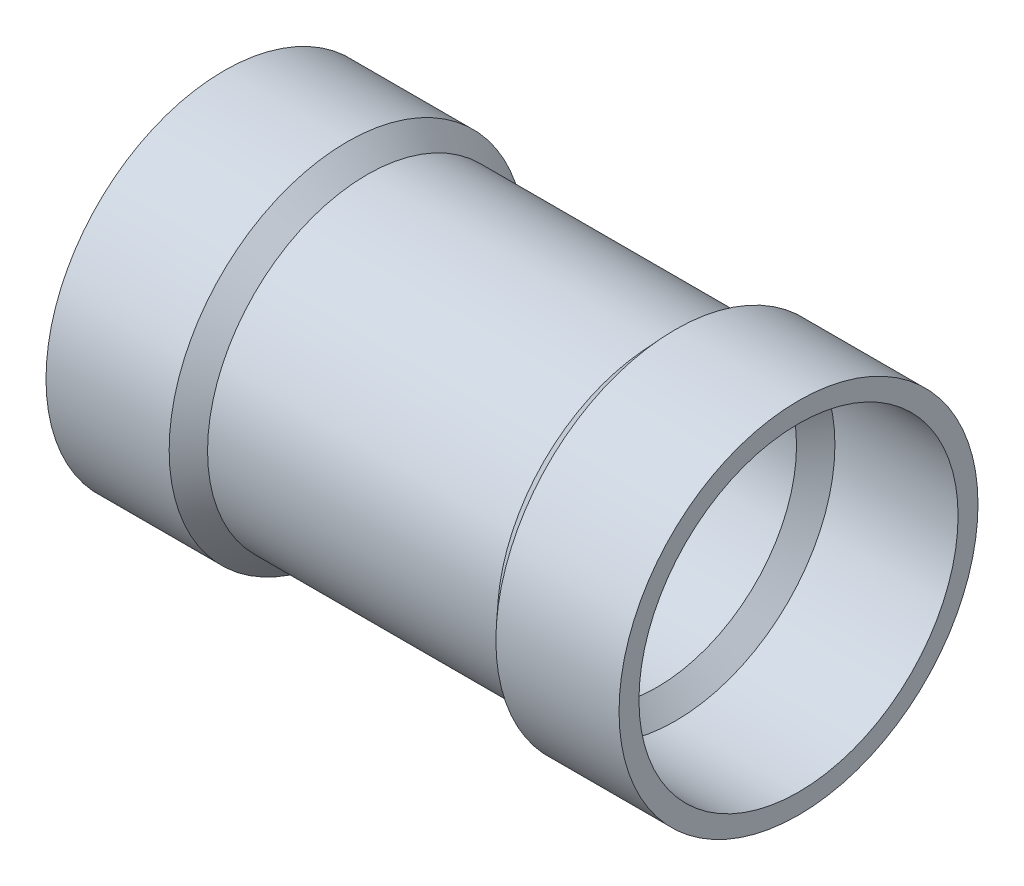
ISO-10303-21;
HEADER;
FILE_DESCRIPTION(('STEP AP214'),'2;1');
FILE_NAME('part.step','',(''),(''),'','','');
FILE_SCHEMA(('AUTOMOTIVE_DESIGN { 1 0 10303 214 1 1 1 1 }'));
ENDSEC;
DATA;
#1=APPLICATION_CONTEXT('core data for automotive mechanical design processes');
#2=APPLICATION_PROTOCOL_DEFINITION('international standard','automotive_design',2000,#1);
#3=PRODUCT_CONTEXT('',#1,'mechanical');
#4=PRODUCT('Part','Part','',(#3));
#5=PRODUCT_RELATED_PRODUCT_CATEGORY('part','',(#4));
#6=PRODUCT_DEFINITION_FORMATION('','',#4);
#7=PRODUCT_DEFINITION_CONTEXT('part definition',#1,'design');
#8=PRODUCT_DEFINITION('design','',#6,#7);
#9=PRODUCT_DEFINITION_SHAPE('','',#8);
#10=(LENGTH_UNIT() NAMED_UNIT(*) SI_UNIT(.MILLI.,.METRE.));
#11=(NAMED_UNIT(*) PLANE_ANGLE_UNIT() SI_UNIT($,.RADIAN.));
#12=(NAMED_UNIT(*) SI_UNIT($,.STERADIAN.) SOLID_ANGLE_UNIT());
#13=UNCERTAINTY_MEASURE_WITH_UNIT(LENGTH_MEASURE(1.E-05),#10,'distance_accuracy_value','');
#14=(GEOMETRIC_REPRESENTATION_CONTEXT(3) GLOBAL_UNCERTAINTY_ASSIGNED_CONTEXT((#13)) GLOBAL_UNIT_ASSIGNED_CONTEXT((#10,
#11,#12)) REPRESENTATION_CONTEXT('',''));
#15=CARTESIAN_POINT('',(0.,0.,0.));
#16=DIRECTION('',(0.,0.,1.));
#17=DIRECTION('',(1.,0.,0.));
#18=AXIS2_PLACEMENT_3D('',#15,#16,#17);
#19=CARTESIAN_POINT('',(-79.5,0.,0.));
#20=DIRECTION('',(-1.,0.,0.));
#21=DIRECTION('',(0.,0.,1.));
#22=AXIS2_PLACEMENT_3D('',#19,#20,#21);
#23=CYLINDRICAL_SURFACE('',#22,44.0509804864072);
#24=CARTESIAN_POINT('',(-40.,0.,0.));
#25=DIRECTION('',(-1.,0.,0.));
#26=DIRECTION('',(0.,0.,1.));
#27=AXIS2_PLACEMENT_3D('',#24,#25,#26);
#28=CIRCLE('',#27,44.0509804864072);
#29=CARTESIAN_POINT('',(-40.,0.,44.0509804864072));
#30=VERTEX_POINT('',#29);
#31=EDGE_CURVE('E78',#30,#30,#28,.T.);
#32=ORIENTED_EDGE('',*,*,#31,.F.);
#33=EDGE_LOOP('',(#32));
#34=FACE_BOUND('',#33,.T.);
#35=CARTESIAN_POINT('',(40.,0.,0.));
#36=DIRECTION('',(-1.,0.,0.));
#37=DIRECTION('',(0.,0.,1.));
#38=AXIS2_PLACEMENT_3D('',#35,#36,#37);
#39=CIRCLE('',#38,44.0509804864072);
#40=CARTESIAN_POINT('',(40.,0.,44.0509804864072));
#41=VERTEX_POINT('',#40);
#42=EDGE_CURVE('E10',#41,#41,#39,.T.);
#43=ORIENTED_EDGE('',*,*,#42,.T.);
#44=EDGE_LOOP('',(#43));
#45=FACE_BOUND('',#44,.T.);
#46=ADVANCED_FACE('F38',(#34,#45),#23,.T.);
#47=CARTESIAN_POINT('',(45.0990195135928,0.,0.));
#48=DIRECTION('',(1.,0.,0.));
#49=DIRECTION('',(0.,0.,-1.));
#50=AXIS2_PLACEMENT_3D('',#47,#48,#49);
#51=CONICAL_SURFACE('',#50,49.5509804864072,0.823211977125876);
#52=ORIENTED_EDGE('',*,*,#42,.F.);
#53=EDGE_LOOP('',(#52));
#54=FACE_BOUND('',#53,.T.);
#55=CARTESIAN_POINT('',(45.0990195135928,0.,0.));
#56=DIRECTION('',(-1.,0.,0.));
#57=DIRECTION('',(0.,0.,1.));
#58=AXIS2_PLACEMENT_3D('',#55,#56,#57);
#59=CIRCLE('',#58,49.5509804864072);
#60=CARTESIAN_POINT('',(45.0990195135928,0.,49.5509804864072));
#61=VERTEX_POINT('',#60);
#62=EDGE_CURVE('E44',#61,#61,#59,.T.);
#63=ORIENTED_EDGE('',*,*,#62,.T.);
#64=EDGE_LOOP('',(#63));
#65=FACE_BOUND('',#64,.T.);
#66=ADVANCED_FACE('F85',(#54,#65),#51,.T.);
#67=CARTESIAN_POINT('',(-79.5,0.,0.));
#68=DIRECTION('',(-1.,0.,0.));
#69=DIRECTION('',(0.,0.,1.));
#70=AXIS2_PLACEMENT_3D('',#67,#68,#69);
#71=CYLINDRICAL_SURFACE('',#70,49.5509804864072);
#72=ORIENTED_EDGE('',*,*,#62,.F.);
#73=EDGE_LOOP('',(#72));
#74=FACE_BOUND('',#73,.T.);
#75=CARTESIAN_POINT('',(79.0990195135928,0.,0.));
#76=DIRECTION('',(-1.,0.,0.));
#77=DIRECTION('',(0.,0.,1.));
#78=AXIS2_PLACEMENT_3D('',#75,#76,#77);
#79=CIRCLE('',#78,49.5509804864072);
#80=CARTESIAN_POINT('',(79.0990195135928,0.,49.5509804864072));
#81=VERTEX_POINT('',#80);
#82=EDGE_CURVE('E48',#81,#81,#79,.T.);
#83=ORIENTED_EDGE('',*,*,#82,.T.);
#84=EDGE_LOOP('',(#83));
#85=FACE_BOUND('',#84,.T.);
#86=ADVANCED_FACE('F89',(#74,#85),#71,.T.);
#87=CARTESIAN_POINT('',(79.0990195135928,49.5509804864072,0.));
#88=DIRECTION('',(-1.,0.,0.));
#89=DIRECTION('',(0.,0.,1.));
#90=AXIS2_PLACEMENT_3D('',#87,#88,#89);
#91=PLANE('',#90);
#92=ORIENTED_EDGE('',*,*,#82,.F.);
#93=EDGE_LOOP('',(#92));
#94=FACE_BOUND('',#93,.T.);
#95=CARTESIAN_POINT('',(79.0990195135928,0.,0.));
#96=DIRECTION('',(-1.,0.,0.));
#97=DIRECTION('',(0.,0.,1.));
#98=AXIS2_PLACEMENT_3D('',#95,#96,#97);
#99=CIRCLE('',#98,44.0509804864072);
#100=CARTESIAN_POINT('',(79.0990195135928,0.,44.0509804864072));
#101=VERTEX_POINT('',#100);
#102=EDGE_CURVE('E52',#101,#101,#99,.T.);
#103=ORIENTED_EDGE('',*,*,#102,.T.);
#104=EDGE_LOOP('',(#103));
#105=FACE_BOUND('',#104,.T.);
#106=ADVANCED_FACE('F94',(#94,#105),#91,.F.);
#107=CARTESIAN_POINT('',(-79.5,0.,0.));
#108=DIRECTION('',(-1.,0.,0.));
#109=DIRECTION('',(0.,0.,1.));
#110=AXIS2_PLACEMENT_3D('',#107,#108,#109);
#111=CYLINDRICAL_SURFACE('',#110,44.0509804864072);
#112=ORIENTED_EDGE('',*,*,#102,.F.);
#113=EDGE_LOOP('',(#112));
#114=FACE_BOUND('',#113,.T.);
#115=CARTESIAN_POINT('',(45.0990195135928,0.,0.));
#116=DIRECTION('',(-1.,0.,0.));
#117=DIRECTION('',(0.,0.,1.));
#118=AXIS2_PLACEMENT_3D('',#115,#116,#117);
#119=CIRCLE('',#118,44.0509804864072);
#120=CARTESIAN_POINT('',(45.0990195135928,0.,44.0509804864072));
#121=VERTEX_POINT('',#120);
#122=EDGE_CURVE('E57',#121,#121,#119,.T.);
#123=ORIENTED_EDGE('',*,*,#122,.T.);
#124=EDGE_LOOP('',(#123));
#125=FACE_BOUND('',#124,.T.);
#126=ADVANCED_FACE('F100',(#114,#125),#111,.F.);
#127=CARTESIAN_POINT('',(40.,0.,0.));
#128=DIRECTION('',(1.,0.,0.));
#129=DIRECTION('',(0.,0.,-1.));
#130=AXIS2_PLACEMENT_3D('',#127,#128,#129);
#131=CONICAL_SURFACE('',#130,38.5509804864072,0.823211977125876);
#132=ORIENTED_EDGE('',*,*,#122,.F.);
#133=EDGE_LOOP('',(#132));
#134=FACE_BOUND('',#133,.T.);
#135=CARTESIAN_POINT('',(40.,0.,0.));
#136=DIRECTION('',(-1.,0.,0.));
#137=DIRECTION('',(0.,0.,1.));
#138=AXIS2_PLACEMENT_3D('',#135,#136,#137);
#139=CIRCLE('',#138,38.5509804864072);
#140=CARTESIAN_POINT('',(40.,0.,38.5509804864072));
#141=VERTEX_POINT('',#140);
#142=EDGE_CURVE('E60',#141,#141,#139,.T.);
#143=ORIENTED_EDGE('',*,*,#142,.T.);
#144=EDGE_LOOP('',(#143));
#145=FACE_BOUND('',#144,.T.);
#146=ADVANCED_FACE('F104',(#134,#145),#131,.F.);
#147=CARTESIAN_POINT('',(-79.5,0.,0.));
#148=DIRECTION('',(-1.,0.,0.));
#149=DIRECTION('',(0.,0.,1.));
#150=AXIS2_PLACEMENT_3D('',#147,#148,#149);
#151=CYLINDRICAL_SURFACE('',#150,38.5509804864072);
#152=ORIENTED_EDGE('',*,*,#142,.F.);
#153=EDGE_LOOP('',(#152));
#154=FACE_BOUND('',#153,.T.);
#155=CARTESIAN_POINT('',(-40.,0.,0.));
#156=DIRECTION('',(-1.,0.,0.));
#157=DIRECTION('',(0.,0.,1.));
#158=AXIS2_PLACEMENT_3D('',#155,#156,#157);
#159=CIRCLE('',#158,38.5509804864072);
#160=CARTESIAN_POINT('',(-40.,0.,38.5509804864072));
#161=VERTEX_POINT('',#160);
#162=EDGE_CURVE('E63',#161,#161,#159,.T.);
#163=ORIENTED_EDGE('',*,*,#162,.T.);
#164=EDGE_LOOP('',(#163));
#165=FACE_BOUND('',#164,.T.);
#166=ADVANCED_FACE('F108',(#154,#165),#151,.F.);
#167=CARTESIAN_POINT('',(-45.5,0.,0.));
#168=DIRECTION('',(-1.,0.,0.));
#169=DIRECTION('',(0.,0.,1.));
#170=AXIS2_PLACEMENT_3D('',#167,#168,#169);
#171=CONICAL_SURFACE('',#170,43.6499999999999,0.747584349669015);
#172=ORIENTED_EDGE('',*,*,#162,.F.);
#173=EDGE_LOOP('',(#172));
#174=FACE_BOUND('',#173,.T.);
#175=CARTESIAN_POINT('',(-45.5,0.,0.));
#176=DIRECTION('',(-1.,0.,0.));
#177=DIRECTION('',(0.,0.,1.));
#178=AXIS2_PLACEMENT_3D('',#175,#176,#177);
#179=CIRCLE('',#178,43.6499999999999);
#180=CARTESIAN_POINT('',(-45.5,0.,43.6499999999999));
#181=VERTEX_POINT('',#180);
#182=EDGE_CURVE('E66',#181,#181,#179,.T.);
#183=ORIENTED_EDGE('',*,*,#182,.T.);
#184=EDGE_LOOP('',(#183));
#185=FACE_BOUND('',#184,.T.);
#186=ADVANCED_FACE('F112',(#174,#185),#171,.F.);
#187=CARTESIAN_POINT('',(-79.5,0.,0.));
#188=DIRECTION('',(-1.,0.,0.));
#189=DIRECTION('',(0.,0.,1.));
#190=AXIS2_PLACEMENT_3D('',#187,#188,#189);
#191=CYLINDRICAL_SURFACE('',#190,43.6499999999999);
#192=ORIENTED_EDGE('',*,*,#182,.F.);
#193=EDGE_LOOP('',(#192));
#194=FACE_BOUND('',#193,.T.);
#195=CARTESIAN_POINT('',(-79.5,0.,0.));
#196=DIRECTION('',(-1.,0.,0.));
#197=DIRECTION('',(0.,0.,1.));
#198=AXIS2_PLACEMENT_3D('',#195,#196,#197);
#199=CIRCLE('',#198,43.65);
#200=CARTESIAN_POINT('',(-79.5,0.,43.65));
#201=VERTEX_POINT('',#200);
#202=EDGE_CURVE('E69',#201,#201,#199,.T.);
#203=ORIENTED_EDGE('',*,*,#202,.T.);
#204=EDGE_LOOP('',(#203));
#205=FACE_BOUND('',#204,.T.);
#206=ADVANCED_FACE('F116',(#194,#205),#191,.F.);
#207=CARTESIAN_POINT('',(-79.5,43.65,0.));
#208=DIRECTION('',(1.,0.,0.));
#209=DIRECTION('',(0.,0.,-1.));
#210=AXIS2_PLACEMENT_3D('',#207,#208,#209);
#211=PLANE('',#210);
#212=ORIENTED_EDGE('',*,*,#202,.F.);
#213=EDGE_LOOP('',(#212));
#214=FACE_BOUND('',#213,.T.);
#215=CARTESIAN_POINT('',(-79.5,0.,0.));
#216=DIRECTION('',(-1.,0.,0.));
#217=DIRECTION('',(0.,0.,1.));
#218=AXIS2_PLACEMENT_3D('',#215,#216,#217);
#219=CIRCLE('',#218,49.15);
#220=CARTESIAN_POINT('',(-79.5,0.,49.15));
#221=VERTEX_POINT('',#220);
#222=EDGE_CURVE('E72',#221,#221,#219,.T.);
#223=ORIENTED_EDGE('',*,*,#222,.T.);
#224=EDGE_LOOP('',(#223));
#225=FACE_BOUND('',#224,.T.);
#226=ADVANCED_FACE('F120',(#214,#225),#211,.F.);
#227=CARTESIAN_POINT('',(-79.5,0.,0.));
#228=DIRECTION('',(-1.,0.,0.));
#229=DIRECTION('',(0.,0.,1.));
#230=AXIS2_PLACEMENT_3D('',#227,#228,#229);
#231=CYLINDRICAL_SURFACE('',#230,49.15);
#232=ORIENTED_EDGE('',*,*,#222,.F.);
#233=EDGE_LOOP('',(#232));
#234=FACE_BOUND('',#233,.T.);
#235=CARTESIAN_POINT('',(-45.5,0.,0.));
#236=DIRECTION('',(-1.,0.,0.));
#237=DIRECTION('',(0.,0.,1.));
#238=AXIS2_PLACEMENT_3D('',#235,#236,#237);
#239=CIRCLE('',#238,49.15);
#240=CARTESIAN_POINT('',(-45.5,0.,49.15));
#241=VERTEX_POINT('',#240);
#242=EDGE_CURVE('E75',#241,#241,#239,.T.);
#243=ORIENTED_EDGE('',*,*,#242,.T.);
#244=EDGE_LOOP('',(#243));
#245=FACE_BOUND('',#244,.T.);
#246=ADVANCED_FACE('F124',(#234,#245),#231,.T.);
#247=CARTESIAN_POINT('',(-40.,0.,0.));
#248=DIRECTION('',(-1.,0.,0.));
#249=DIRECTION('',(0.,0.,1.));
#250=AXIS2_PLACEMENT_3D('',#247,#248,#249);
#251=CONICAL_SURFACE('',#250,44.0509804864072,0.747584349669016);
#252=ORIENTED_EDGE('',*,*,#242,.F.);
#253=EDGE_LOOP('',(#252));
#254=FACE_BOUND('',#253,.T.);
#255=ORIENTED_EDGE('',*,*,#31,.T.);
#256=EDGE_LOOP('',(#255));
#257=FACE_BOUND('',#256,.T.);
#258=ADVANCED_FACE('F82',(#254,#257),#251,.T.);
#259=CLOSED_SHELL('',(#46,#66,#86,#106,#126,#146,#166,#186,#206,#226,#246,#258));
#260=MANIFOLD_SOLID_BREP('B2',#259);
#261=ADVANCED_BREP_SHAPE_REPRESENTATION('',(#18,#260),#14);
#262=SHAPE_DEFINITION_REPRESENTATION(#9,#261);
ENDSEC;
END-ISO-10303-21;
